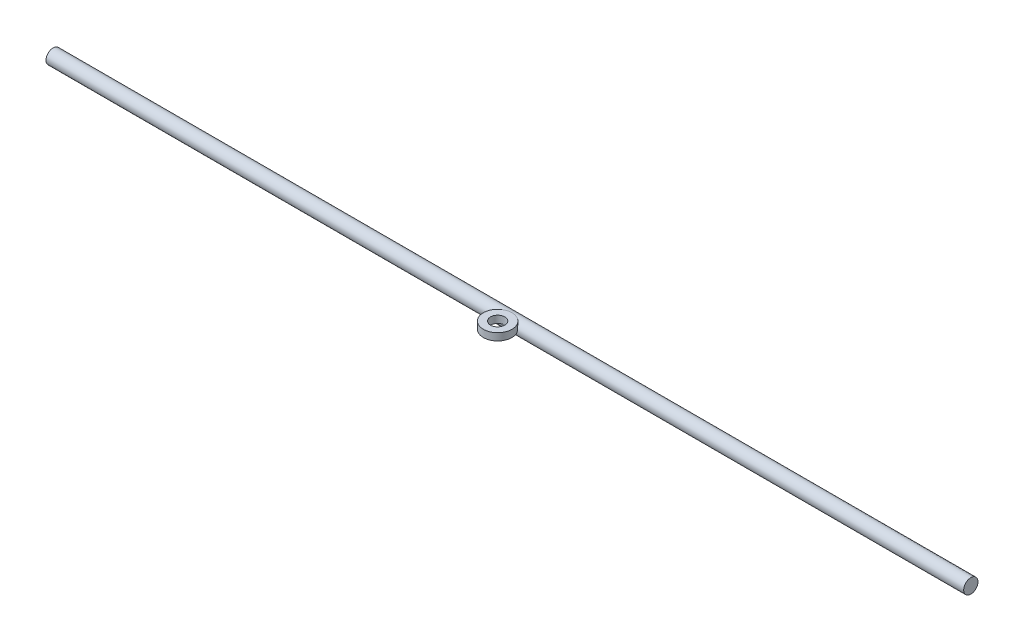
ISO-10303-21;
HEADER;
FILE_DESCRIPTION(('STEP AP214'),'2;1');
FILE_NAME('part.step','',(''),(''),'','','');
FILE_SCHEMA(('AUTOMOTIVE_DESIGN { 1 0 10303 214 1 1 1 1 }'));
ENDSEC;
DATA;
#1=APPLICATION_CONTEXT('core data for automotive mechanical design processes');
#2=APPLICATION_PROTOCOL_DEFINITION('international standard','automotive_design',2000,#1);
#3=PRODUCT_CONTEXT('',#1,'mechanical');
#4=PRODUCT('Part','Part','',(#3));
#5=PRODUCT_RELATED_PRODUCT_CATEGORY('part','',(#4));
#6=PRODUCT_DEFINITION_FORMATION('','',#4);
#7=PRODUCT_DEFINITION_CONTEXT('part definition',#1,'design');
#8=PRODUCT_DEFINITION('design','',#6,#7);
#9=PRODUCT_DEFINITION_SHAPE('','',#8);
#10=(LENGTH_UNIT() NAMED_UNIT(*) SI_UNIT(.MILLI.,.METRE.));
#11=(NAMED_UNIT(*) PLANE_ANGLE_UNIT() SI_UNIT($,.RADIAN.));
#12=(NAMED_UNIT(*) SI_UNIT($,.STERADIAN.) SOLID_ANGLE_UNIT());
#13=UNCERTAINTY_MEASURE_WITH_UNIT(LENGTH_MEASURE(1.E-05),#10,'distance_accuracy_value','');
#14=(GEOMETRIC_REPRESENTATION_CONTEXT(3) GLOBAL_UNCERTAINTY_ASSIGNED_CONTEXT((#13)) GLOBAL_UNIT_ASSIGNED_CONTEXT((#10,
#11,#12)) REPRESENTATION_CONTEXT('',''));
#15=CARTESIAN_POINT('',(0.,0.,0.));
#16=DIRECTION('',(0.,0.,1.));
#17=DIRECTION('',(1.,0.,0.));
#18=AXIS2_PLACEMENT_3D('',#15,#16,#17);
#19=CARTESIAN_POINT('',(-320.,0.,0.));
#20=DIRECTION('',(1.,0.,0.));
#21=DIRECTION('',(0.,0.,-1.));
#22=AXIS2_PLACEMENT_3D('',#19,#20,#21);
#23=CYLINDRICAL_SURFACE('',#22,5.);
#24=CARTESIAN_POINT('',(320.,0.,0.));
#25=DIRECTION('',(1.,0.,0.));
#26=DIRECTION('',(0.,0.,-1.));
#27=AXIS2_PLACEMENT_3D('',#24,#25,#26);
#28=CIRCLE('',#27,5.);
#29=CARTESIAN_POINT('',(320.,0.,-5.));
#30=VERTEX_POINT('',#29);
#31=EDGE_CURVE('E89',#30,#30,#28,.T.);
#32=ORIENTED_EDGE('',*,*,#31,.F.);
#33=EDGE_LOOP('',(#32));
#34=FACE_BOUND('',#33,.T.);
#35=CARTESIAN_POINT('',(-320.,0.,0.));
#36=DIRECTION('',(1.,0.,0.));
#37=DIRECTION('',(0.,0.,-1.));
#38=AXIS2_PLACEMENT_3D('',#35,#36,#37);
#39=CIRCLE('',#38,5.);
#40=CARTESIAN_POINT('',(-320.,0.,-5.));
#41=VERTEX_POINT('',#40);
#42=EDGE_CURVE('E135',#41,#41,#39,.T.);
#43=ORIENTED_EDGE('',*,*,#42,.T.);
#44=EDGE_LOOP('',(#43));
#45=FACE_BOUND('',#44,.T.);
#46=CARTESIAN_POINT('',(0.,5.,0.));
#47=CARTESIAN_POINT('',(0.139800140532805,4.99998914216106,-1.64953411774006E-06));
#48=CARTESIAN_POINT('',(0.279599008612205,4.99999971712435,0.00293161128916269));
#49=CARTESIAN_POINT('',(0.558951182691962,4.99998481796157,0.0146552817651165));
#50=CARTESIAN_POINT('',(0.698504488279619,4.99995934377498,0.0234457012520745));
#51=CARTESIAN_POINT('',(0.977171774875295,4.99979340151413,0.0468751978808742));
#52=CARTESIAN_POINT('',(1.11628558128742,4.99965289239646,0.0615163615597334));
#53=CARTESIAN_POINT('',(1.39376674870488,4.99909670772593,0.096617866777976));
#54=CARTESIAN_POINT('',(1.53213411181994,4.99868103295118,0.117078191861396));
#55=CARTESIAN_POINT('',(1.94736630640988,4.99671275391144,0.187413617385381));
#56=CARTESIAN_POINT('',(2.22278832364154,4.99443550926618,0.246111117331495));
#57=CARTESIAN_POINT('',(2.76755428049912,4.98553578349395,0.386481190947482));
#58=CARTESIAN_POINT('',(3.03689988080349,4.97891450484001,0.46814740306997));
#59=CARTESIAN_POINT('',(3.51745927684456,4.95992802984724,0.636266400188529));
#60=CARTESIAN_POINT('',(3.73006013603067,4.94888089289344,0.718914864376468));
#61=CARTESIAN_POINT('',(4.14872659779974,4.91947428900589,0.89835629569658));
#62=CARTESIAN_POINT('',(4.35479211064774,4.90111472171414,0.99514945694328));
#63=CARTESIAN_POINT('',(4.7583706125626,4.8545819563223,1.20175346244203));
#64=CARTESIAN_POINT('',(4.95590782245111,4.82643893209432,1.31152360430033));
#65=CARTESIAN_POINT('',(5.34147781162199,4.75745956206622,1.54310240884557));
#66=CARTESIAN_POINT('',(5.52951406874083,4.71662790067116,1.66490661748192));
#67=CARTESIAN_POINT('',(5.84244241215245,4.63303893159044,1.88266017635314));
#68=CARTESIAN_POINT('',(5.97009861226641,4.59412330902775,1.97612550752586));
#69=CARTESIAN_POINT('',(6.21886389016391,4.50706149141273,2.16735554517715));
#70=CARTESIAN_POINT('',(6.33997461979957,4.45891763932518,2.26511915551634));
#71=CARTESIAN_POINT('',(6.57478233010431,4.3523420225593,2.46369710064056));
#72=CARTESIAN_POINT('',(6.68848555757562,4.29391908432197,2.56450875711478));
#73=CARTESIAN_POINT('',(6.90778050525223,4.16578673061267,2.76778695237177));
#74=CARTESIAN_POINT('',(7.01337355959722,4.09607917737088,2.87025321559762));
#75=CARTESIAN_POINT('',(7.19884885497205,3.95723959257726,3.05802689584982));
#76=CARTESIAN_POINT('',(7.28008612893296,3.88994068678859,3.1433532868894));
#77=CARTESIAN_POINT('',(7.43599218655022,3.74672632750304,3.31275366062449));
#78=CARTESIAN_POINT('',(7.51066226186664,3.67081257516241,3.39682788688594));
#79=CARTESIAN_POINT('',(7.6531098780371,3.51028955668752,3.56246605522402));
#80=CARTESIAN_POINT('',(7.72088831242561,3.42568142068943,3.6440303217703));
#81=CARTESIAN_POINT('',(7.84932950522482,3.247890318759,3.80334775638808));
#82=CARTESIAN_POINT('',(7.90999216887631,3.15470723866546,3.8811008736993));
#83=CARTESIAN_POINT('',(8.02432408426386,2.95968058802516,4.03181652705226));
#84=CARTESIAN_POINT('',(8.07796079140625,2.85780009224932,4.10475604324047));
#85=CARTESIAN_POINT('',(8.17789455229584,2.64630545640413,4.24418533332557));
#86=CARTESIAN_POINT('',(8.2241913903903,2.53669108924253,4.31067491769469));
#87=CARTESIAN_POINT('',(8.30953242981146,2.31043481699848,4.43605992756374));
#88=CARTESIAN_POINT('',(8.3485731099945,2.19378953624449,4.49495166189195));
#89=CARTESIAN_POINT('',(8.41951139462065,1.95444091978436,4.60406938899334));
#90=CARTESIAN_POINT('',(8.4514097901313,1.83173825682289,4.65429634132172));
#91=CARTESIAN_POINT('',(8.50586855798514,1.59179039811977,4.74142474898931));
#92=CARTESIAN_POINT('',(8.52898701294493,1.47494787963083,4.77908962519889));
#93=CARTESIAN_POINT('',(8.56952899116471,1.23789037463573,4.8459043283864));
#94=CARTESIAN_POINT('',(8.58695281871964,1.11767556870211,4.87505461033661));
#95=CARTESIAN_POINT('',(8.61620888787173,0.875007662598516,4.92439504671448));
#96=CARTESIAN_POINT('',(8.6280519895824,0.752559395383316,4.94460259902243));
#97=CARTESIAN_POINT('',(8.64629291893926,0.506152900605519,4.97586328576335));
#98=CARTESIAN_POINT('',(8.65269409199955,0.382195648302573,4.98692204428533));
#99=CARTESIAN_POINT('',(8.657690107507,0.214989709339041,4.99556148052155));
#100=CARTESIAN_POINT('',(8.65865233930065,0.17198570423535,4.99722669885626));
#101=CARTESIAN_POINT('',(8.65993382375217,0.0859894305317277,4.9994451891233));
#102=CARTESIAN_POINT('',(8.66025382182277,0.0429972063007321,4.99999975014563));
#103=CARTESIAN_POINT('',(8.66025403784456,0.,5.));
#104=B_SPLINE_CURVE_WITH_KNOTS('',3,(#46,#47,#48,#49,#50,#51,#52,#53,#54,#55,#56,#57,#58,#59,
#60,#61,#62,#63,#64,#65,#66,#67,#68,#69,#70,#71,#72,#73,#74,#75,#76,#77,#78,#79,#80,#81,#82,#83,
#84,#85,#86,#87,#88,#89,#90,#91,#92,#93,#94,#95,#96,#97,#98,#99,#100,#101,#102,#103),
.UNSPECIFIED.,.F.,.F.,(4,2,2,2,2,2,2,2,2,2,2,2,2,2,2,2,2,2,2,2,2,2,2,2,2,2,2,2,4),(0.,
0.41936718061986,0.838735065367234,1.25825264195099,1.67776903219588,2.52152207908425,
3.36504166498959,4.04955146499342,4.73407065973913,5.41649713945005,6.09867197890897,
6.58706888878977,7.075341962924,7.56319779516843,8.05097320149911,8.45760945728659,
8.86416555470606,9.27066887277155,9.67717760354036,10.0855073091988,10.4938490097727,
10.9023883489688,11.3108824166217,11.6851895816918,12.0594767422209,12.4330324995092,
12.8063584477875,12.9354852963143,13.0644621860571),.UNSPECIFIED.);
#105=CARTESIAN_POINT('',(0.,5.,0.));
#106=VERTEX_POINT('',#105);
#107=CARTESIAN_POINT('',(8.66025403784439,0.,5.));
#108=VERTEX_POINT('',#107);
#109=EDGE_CURVE('E80',#106,#108,#104,.T.);
#110=ORIENTED_EDGE('',*,*,#109,.T.);
#111=DIRECTION('',(1.,0.,0.));
#112=VECTOR('',#111,1.);
#113=CARTESIAN_POINT('',(-320.,0.,5.));
#114=LINE('',#113,#112);
#115=CARTESIAN_POINT('',(0.,0.,5.));
#116=VERTEX_POINT('',#115);
#117=EDGE_CURVE('E12',#108,#116,#114,.F.);
#118=ORIENTED_EDGE('',*,*,#117,.T.);
#119=CARTESIAN_POINT('',(-8.66025403784439,0.,5.));
#120=VERTEX_POINT('',#119);
#121=EDGE_CURVE('E49',#116,#120,#114,.F.);
#122=ORIENTED_EDGE('',*,*,#121,.T.);
#123=CARTESIAN_POINT('',(-8.66025403784439,0.,5.));
#124=CARTESIAN_POINT('',(-8.66024609326101,0.122492872011071,5.0000205346112));
#125=CARTESIAN_POINT('',(-8.65765505794739,0.244983766188433,4.99549950915938));
#126=CARTESIAN_POINT('',(-8.64724881983724,0.489077620313457,4.97752179271196));
#127=CARTESIAN_POINT('',(-8.63943393219399,0.610680633379317,4.9640656407699));
#128=CARTESIAN_POINT('',(-8.61853622828838,0.851965647314818,4.92838935511424));
#129=CARTESIAN_POINT('',(-8.60546058666182,0.971650034580792,4.90618115831345));
#130=CARTESIAN_POINT('',(-8.57393518361783,1.20840868356319,4.85329341696936));
#131=CARTESIAN_POINT('',(-8.55548550149033,1.32548298376205,4.82261399741292));
#132=CARTESIAN_POINT('',(-8.51307609535753,1.55623397403235,4.75317356172158));
#133=CARTESIAN_POINT('',(-8.48911435274261,1.66990940210354,4.71440958537221));
#134=CARTESIAN_POINT('',(-8.43553673536373,1.89306592665629,4.62931594614087));
#135=CARTESIAN_POINT('',(-8.4059187895839,2.00254546913211,4.58298351297385));
#136=CARTESIAN_POINT('',(-8.34092981062878,2.21645174193167,4.48344150135111));
#137=CARTESIAN_POINT('',(-8.30556300299918,2.32088211091487,4.43023697989354));
#138=CARTESIAN_POINT('',(-8.22894758504274,2.5241571178733,4.31765390155602));
#139=CARTESIAN_POINT('',(-8.18769681261962,2.6229996838533,4.25827307734025));
#140=CARTESIAN_POINT('',(-8.09903364722441,2.81501324562833,4.13386704003586));
#141=CARTESIAN_POINT('',(-8.05158954351588,2.9081511555277,4.06881339322608));
#142=CARTESIAN_POINT('',(-7.95070439285662,3.08776775580658,3.934245797638));
#143=CARTESIAN_POINT('',(-7.89726120332706,3.17424404827042,3.86473025911102));
#144=CARTESIAN_POINT('',(-7.7844698043468,3.34019265044049,3.72223978823389));
#145=CARTESIAN_POINT('',(-7.72512219697667,3.41966567272328,3.64926520900277));
#146=CARTESIAN_POINT('',(-7.6006695362958,3.57148365468618,3.50082787404027));
#147=CARTESIAN_POINT('',(-7.53556237419423,3.64382598288173,3.42536421335717));
#148=CARTESIAN_POINT('',(-7.32356703163396,3.8585092709771,3.18736049649492));
#149=CARTESIAN_POINT('',(-7.16685505152501,3.98835809863385,3.02208508321891));
#150=CARTESIAN_POINT('',(-6.83123914842219,4.21747080538094,2.69319024898048));
#151=CARTESIAN_POINT('',(-6.65232657697629,4.31672271235576,2.52957150040324));
#152=CARTESIAN_POINT('',(-6.32251815981267,4.46714630032472,2.2501431300979));
#153=CARTESIAN_POINT('',(-6.17570542801059,4.52413694981026,2.13255512477259));
#154=CARTESIAN_POINT('',(-5.87273200558984,4.6250230534476,1.90388777170022));
#155=CARTESIAN_POINT('',(-5.71656748012134,4.66891309072444,1.79281113150178));
#156=CARTESIAN_POINT('',(-5.39583792277488,4.74567639158581,1.57846533124136));
#157=CARTESIAN_POINT('',(-5.23125308274322,4.77852215882001,1.47521614608058));
#158=CARTESIAN_POINT('',(-4.89519375882405,4.83502884645017,1.27789792153273));
#159=CARTESIAN_POINT('',(-4.72371931275061,4.85868981724991,1.1838288317698));
#160=CARTESIAN_POINT('',(-4.31565989663792,4.90546995887911,0.975374644267924));
#161=CARTESIAN_POINT('',(-4.07672323953897,4.92568153229488,0.864925476255115));
#162=CARTESIAN_POINT('',(-3.59032723427271,4.95689629301643,0.663032484964266));
#163=CARTESIAN_POINT('',(-3.34286449786806,4.96789577447789,0.571596321353916));
#164=CARTESIAN_POINT('',(-2.84143302834591,4.98395300501167,0.408559722270843));
#165=CARTESIAN_POINT('',(-2.58746716337712,4.98901332890135,0.336950701384856));
#166=CARTESIAN_POINT('',(-2.07475277575824,4.99579522983428,0.214046618844069));
#167=CARTESIAN_POINT('',(-1.8160062767403,4.99751818830693,0.162743159146422));
#168=CARTESIAN_POINT('',(-1.29811990899362,4.99950623095752,0.081188733891475));
#169=CARTESIAN_POINT('',(-1.03901607386518,4.99978723592213,0.0507110987821472));
#170=CARTESIAN_POINT('',(-0.649577437362651,4.9999675899264,0.0202725410306355));
#171=CARTESIAN_POINT('',(-0.51979859863425,4.99998764197566,0.012672670048666));
#172=CARTESIAN_POINT('',(-0.260017705977503,5.00000079268923,0.00253594924927664));
#173=CARTESIAN_POINT('',(-0.130015613089033,4.99999388603929,9.78284804091823E-08));
#174=CARTESIAN_POINT('',(0.,5.,0.));
#175=B_SPLINE_CURVE_WITH_KNOTS('',3,(#123,#124,#125,#126,#127,#128,#129,#130,#131,#132,#133,
#134,#135,#136,#137,#138,#139,#140,#141,#142,#143,#144,#145,#146,#147,#148,#149,#150,#151,#152,
#153,#154,#155,#156,#157,#158,#159,#160,#161,#162,#163,#164,#165,#166,#167,#168,#169,#170,#171,
#172,#173,#174),.UNSPECIFIED.,.F.,.F.,(4,2,2,2,2,2,2,2,2,2,2,2,2,2,2,2,2,2,2,2,2,2,2,2,2,4),(0.,
0.367365046180228,0.73470793134975,1.10155152200076,1.46838970042477,1.83536243566214,
2.202469796296,2.56930853468129,2.9362824189702,3.30521491579451,3.67427959895871,
4.04330668665212,4.41246945281553,5.19567285960974,5.97918233429422,6.56802809355305,
7.15711699406712,7.74766184353557,8.33820345220079,9.12910897921245,9.92033251942286,
10.7112129117222,11.5017658663716,12.2835711539707,12.6734893943441,13.0634845014498),.UNSPECIFIED.);
#176=EDGE_CURVE('E82',#120,#106,#175,.T.);
#177=ORIENTED_EDGE('',*,*,#176,.T.);
#178=EDGE_LOOP('',(#110,#118,#122,#177));
#179=FACE_BOUND('',#178,.T.);
#180=ADVANCED_FACE('F45',(#34,#45,#179),#23,.T.);
#181=CARTESIAN_POINT('',(-320.,0.,0.));
#182=DIRECTION('',(1.,0.,0.));
#183=DIRECTION('',(0.,0.,-1.));
#184=AXIS2_PLACEMENT_3D('',#181,#182,#183);
#185=PLANE('',#184);
#186=ORIENTED_EDGE('',*,*,#42,.F.);
#187=EDGE_LOOP('',(#186));
#188=FACE_BOUND('',#187,.T.);
#189=ADVANCED_FACE('F47',(#188),#185,.F.);
#190=CARTESIAN_POINT('',(320.,0.,0.));
#191=DIRECTION('',(1.,0.,0.));
#192=DIRECTION('',(0.,0.,-1.));
#193=AXIS2_PLACEMENT_3D('',#190,#191,#192);
#194=PLANE('',#193);
#195=ORIENTED_EDGE('',*,*,#31,.T.);
#196=EDGE_LOOP('',(#195));
#197=FACE_BOUND('',#196,.T.);
#198=ADVANCED_FACE('F113',(#197),#194,.T.);
#199=CARTESIAN_POINT('',(0.,5.,10.));
#200=DIRECTION('',(0.,1.,0.));
#201=DIRECTION('',(0.,0.,1.));
#202=AXIS2_PLACEMENT_3D('',#199,#200,#201);
#203=PLANE('',#202);
#204=CARTESIAN_POINT('',(0.,5.,10.));
#205=DIRECTION('',(0.,1.,0.));
#206=DIRECTION('',(0.,0.,1.));
#207=AXIS2_PLACEMENT_3D('',#204,#205,#206);
#208=CIRCLE('',#207,10.);
#209=EDGE_CURVE('E61',#106,#106,#208,.T.);
#210=ORIENTED_EDGE('',*,*,#209,.T.);
#211=EDGE_LOOP('',(#210));
#212=FACE_BOUND('',#211,.T.);
#213=CARTESIAN_POINT('',(0.,5.,10.));
#214=DIRECTION('',(0.,1.,0.));
#215=DIRECTION('',(0.,0.,1.));
#216=AXIS2_PLACEMENT_3D('',#213,#214,#215);
#217=CIRCLE('',#216,5.);
#218=CARTESIAN_POINT('',(0.,5.,15.));
#219=VERTEX_POINT('',#218);
#220=EDGE_CURVE('E84',#219,#219,#217,.T.);
#221=ORIENTED_EDGE('',*,*,#220,.F.);
#222=EDGE_LOOP('',(#221));
#223=FACE_BOUND('',#222,.T.);
#224=ADVANCED_FACE('F110',(#212,#223),#203,.T.);
#225=CARTESIAN_POINT('',(0.,0.,10.));
#226=DIRECTION('',(0.,1.,0.));
#227=DIRECTION('',(0.,0.,1.));
#228=AXIS2_PLACEMENT_3D('',#225,#226,#227);
#229=PLANE('',#228);
#230=ORIENTED_EDGE('',*,*,#117,.F.);
#231=CARTESIAN_POINT('',(0.,0.,10.));
#232=DIRECTION('',(0.,1.,0.));
#233=DIRECTION('',(0.,0.,1.));
#234=AXIS2_PLACEMENT_3D('',#231,#232,#233);
#235=CIRCLE('',#234,10.);
#236=EDGE_CURVE('E74',#120,#108,#235,.T.);
#237=ORIENTED_EDGE('',*,*,#236,.F.);
#238=ORIENTED_EDGE('',*,*,#121,.F.);
#239=CARTESIAN_POINT('',(0.,0.,10.));
#240=DIRECTION('',(0.,1.,0.));
#241=DIRECTION('',(0.,0.,1.));
#242=AXIS2_PLACEMENT_3D('',#239,#240,#241);
#243=CIRCLE('',#242,5.);
#244=EDGE_CURVE('E76',#116,#116,#243,.T.);
#245=ORIENTED_EDGE('',*,*,#244,.T.);
#246=EDGE_LOOP('',(#230,#237,#238,#245));
#247=FACE_BOUND('',#246,.T.);
#248=ADVANCED_FACE('F73',(#247),#229,.F.);
#249=CARTESIAN_POINT('',(0.,5.,10.));
#250=DIRECTION('',(0.,-1.,0.));
#251=DIRECTION('',(0.,0.,-1.));
#252=AXIS2_PLACEMENT_3D('',#249,#250,#251);
#253=CYLINDRICAL_SURFACE('',#252,10.);
#254=ORIENTED_EDGE('',*,*,#109,.F.);
#255=ORIENTED_EDGE('',*,*,#209,.F.);
#256=ORIENTED_EDGE('',*,*,#176,.F.);
#257=ORIENTED_EDGE('',*,*,#236,.T.);
#258=EDGE_LOOP('',(#254,#255,#256,#257));
#259=FACE_BOUND('',#258,.T.);
#260=ADVANCED_FACE('F79',(#259),#253,.T.);
#261=CARTESIAN_POINT('',(0.,5.,10.));
#262=DIRECTION('',(0.,-1.,0.));
#263=DIRECTION('',(0.,0.,-1.));
#264=AXIS2_PLACEMENT_3D('',#261,#262,#263);
#265=CYLINDRICAL_SURFACE('',#264,5.);
#266=ORIENTED_EDGE('',*,*,#220,.T.);
#267=EDGE_LOOP('',(#266));
#268=FACE_BOUND('',#267,.T.);
#269=ORIENTED_EDGE('',*,*,#244,.F.);
#270=EDGE_LOOP('',(#269));
#271=FACE_BOUND('',#270,.T.);
#272=ADVANCED_FACE('F106',(#268,#271),#265,.F.);
#273=CLOSED_SHELL('',(#180,#189,#198,#224,#248,#260,#272));
#274=MANIFOLD_SOLID_BREP('B2',#273);
#275=ADVANCED_BREP_SHAPE_REPRESENTATION('',(#18,#274),#14);
#276=SHAPE_DEFINITION_REPRESENTATION(#9,#275);
ENDSEC;
END-ISO-10303-21;
